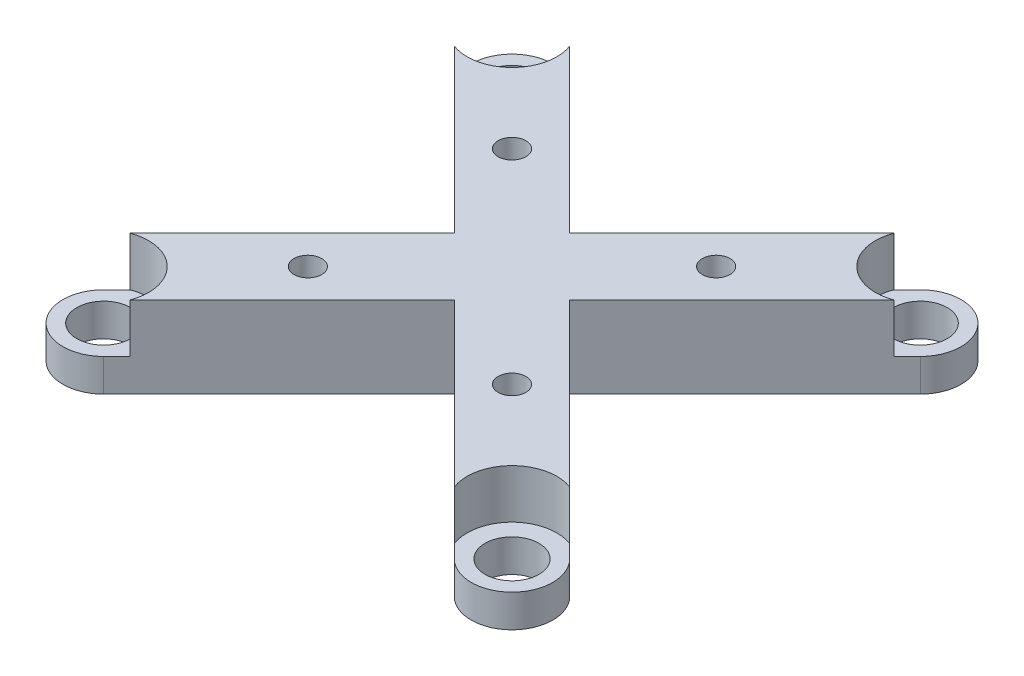
ISO-10303-21;
HEADER;
FILE_DESCRIPTION(('STEP AP214'),'2;1');
FILE_NAME('part.step','',(''),(''),'','','');
FILE_SCHEMA(('AUTOMOTIVE_DESIGN { 1 0 10303 214 1 1 1 1 }'));
ENDSEC;
DATA;
#1=APPLICATION_CONTEXT('core data for automotive mechanical design processes');
#2=APPLICATION_PROTOCOL_DEFINITION('international standard','automotive_design',2000,#1);
#3=PRODUCT_CONTEXT('',#1,'mechanical');
#4=PRODUCT('Part','Part','',(#3));
#5=PRODUCT_RELATED_PRODUCT_CATEGORY('part','',(#4));
#6=PRODUCT_DEFINITION_FORMATION('','',#4);
#7=PRODUCT_DEFINITION_CONTEXT('part definition',#1,'design');
#8=PRODUCT_DEFINITION('design','',#6,#7);
#9=PRODUCT_DEFINITION_SHAPE('','',#8);
#10=(LENGTH_UNIT() NAMED_UNIT(*) SI_UNIT(.MILLI.,.METRE.));
#11=(NAMED_UNIT(*) PLANE_ANGLE_UNIT() SI_UNIT($,.RADIAN.));
#12=(NAMED_UNIT(*) SI_UNIT($,.STERADIAN.) SOLID_ANGLE_UNIT());
#13=UNCERTAINTY_MEASURE_WITH_UNIT(LENGTH_MEASURE(1.E-05),#10,'distance_accuracy_value','');
#14=(GEOMETRIC_REPRESENTATION_CONTEXT(3) GLOBAL_UNCERTAINTY_ASSIGNED_CONTEXT((#13)) GLOBAL_UNIT_ASSIGNED_CONTEXT((#10,
#11,#12)) REPRESENTATION_CONTEXT('',''));
#15=CARTESIAN_POINT('',(0.,0.,0.));
#16=DIRECTION('',(0.,0.,1.));
#17=DIRECTION('',(1.,0.,0.));
#18=AXIS2_PLACEMENT_3D('',#15,#16,#17);
#19=CARTESIAN_POINT('',(-25.,10.,-25.));
#20=DIRECTION('',(0.,-1.,0.));
#21=DIRECTION('',(0.,0.,-1.));
#22=AXIS2_PLACEMENT_3D('',#19,#20,#21);
#23=CYLINDRICAL_SURFACE('',#22,4.99999999999999);
#24=DIRECTION('',(0.,-1.,0.));
#25=VECTOR('',#24,1.);
#26=CARTESIAN_POINT('',(-28.5355339059327,10.,-21.4644660940673));
#27=LINE('',#26,#25);
#28=CARTESIAN_POINT('',(-28.5355339059327,4.,-21.4644660940673));
#29=VERTEX_POINT('',#28);
#30=CARTESIAN_POINT('',(-28.5355339059327,0.,-21.4644660940673));
#31=VERTEX_POINT('',#30);
#32=EDGE_CURVE('E337',#29,#31,#27,.T.);
#33=ORIENTED_EDGE('',*,*,#32,.F.);
#34=CARTESIAN_POINT('',(-25.,4.,-25.));
#35=DIRECTION('',(0.,-1.,0.));
#36=DIRECTION('',(0.,0.,-1.));
#37=AXIS2_PLACEMENT_3D('',#34,#35,#36);
#38=CIRCLE('',#37,4.99999999999999);
#39=CARTESIAN_POINT('',(-21.4644660940673,4.,-28.5355339059327));
#40=VERTEX_POINT('',#39);
#41=EDGE_CURVE('E254',#29,#40,#38,.T.);
#42=ORIENTED_EDGE('',*,*,#41,.T.);
#43=DIRECTION('',(0.,-1.,0.));
#44=VECTOR('',#43,1.);
#45=CARTESIAN_POINT('',(-21.4644660940673,10.,-28.5355339059327));
#46=LINE('',#45,#44);
#47=CARTESIAN_POINT('',(-21.4644660940673,0.,-28.5355339059327));
#48=VERTEX_POINT('',#47);
#49=EDGE_CURVE('E281',#40,#48,#46,.T.);
#50=ORIENTED_EDGE('',*,*,#49,.T.);
#51=CARTESIAN_POINT('',(-25.,0.,-25.));
#52=DIRECTION('',(0.,1.,0.));
#53=DIRECTION('',(0.,0.,-1.));
#54=AXIS2_PLACEMENT_3D('',#51,#52,#53);
#55=CIRCLE('',#54,4.99999999999999);
#56=EDGE_CURVE('E260',#48,#31,#55,.T.);
#57=ORIENTED_EDGE('',*,*,#56,.T.);
#58=EDGE_LOOP('',(#33,#42,#50,#57));
#59=FACE_BOUND('',#58,.T.);
#60=ADVANCED_FACE('F33',(#59),#23,.T.);
#61=CARTESIAN_POINT('',(-7.07106781186547,10.,0.));
#62=DIRECTION('',(0.707106781186548,0.,-0.707106781186547));
#63=DIRECTION('',(-0.707106781186547,0.,-0.707106781186548));
#64=AXIS2_PLACEMENT_3D('',#61,#62,#63);
#65=PLANE('',#64);
#66=DIRECTION('',(0.,1.,0.));
#67=VECTOR('',#66,1.);
#68=CARTESIAN_POINT('',(-26.9153487313308,10.,-19.8442809194653));
#69=LINE('',#68,#67);
#70=CARTESIAN_POINT('',(-26.9153487313308,10.,-19.8442809194653));
#71=VERTEX_POINT('',#70);
#72=CARTESIAN_POINT('',(-26.9153487313308,4.,-19.8442809194653));
#73=VERTEX_POINT('',#72);
#74=EDGE_CURVE('E251',#71,#73,#69,.F.);
#75=ORIENTED_EDGE('',*,*,#74,.T.);
#76=DIRECTION('',(-0.707106781186547,0.,-0.707106781186548));
#77=VECTOR('',#76,1.);
#78=CARTESIAN_POINT('',(-7.07106781186547,4.,0.));
#79=LINE('',#78,#77);
#80=EDGE_CURVE('E257',#73,#29,#79,.T.);
#81=ORIENTED_EDGE('',*,*,#80,.T.);
#82=ORIENTED_EDGE('',*,*,#32,.T.);
#83=DIRECTION('',(0.707106781186547,0.,0.707106781186548));
#84=VECTOR('',#83,1.);
#85=CARTESIAN_POINT('',(-7.07106781186547,0.,0.));
#86=LINE('',#85,#84);
#87=CARTESIAN_POINT('',(-7.07106781186547,0.,0.));
#88=VERTEX_POINT('',#87);
#89=EDGE_CURVE('E284',#31,#88,#86,.T.);
#90=ORIENTED_EDGE('',*,*,#89,.T.);
#91=DIRECTION('',(0.,-1.,0.));
#92=VECTOR('',#91,1.);
#93=CARTESIAN_POINT('',(-7.07106781186547,10.,0.));
#94=LINE('',#93,#92);
#95=CARTESIAN_POINT('',(-7.07106781186547,10.,0.));
#96=VERTEX_POINT('',#95);
#97=EDGE_CURVE('E334',#96,#88,#94,.T.);
#98=ORIENTED_EDGE('',*,*,#97,.F.);
#99=DIRECTION('',(0.707106781186547,0.,0.707106781186548));
#100=VECTOR('',#99,1.);
#101=CARTESIAN_POINT('',(-7.07106781186547,10.,0.));
#102=LINE('',#101,#100);
#103=EDGE_CURVE('E261',#71,#96,#102,.T.);
#104=ORIENTED_EDGE('',*,*,#103,.F.);
#105=EDGE_LOOP('',(#75,#81,#82,#90,#98,#104));
#106=FACE_BOUND('',#105,.T.);
#107=ADVANCED_FACE('F394',(#106),#65,.F.);
#108=CARTESIAN_POINT('',(-7.07106781186547,10.,0.));
#109=DIRECTION('',(0.707106781186548,0.,0.707106781186547));
#110=DIRECTION('',(0.707106781186547,0.,-0.707106781186548));
#111=AXIS2_PLACEMENT_3D('',#108,#109,#110);
#112=PLANE('',#111);
#113=DIRECTION('',(0.,-1.,0.));
#114=VECTOR('',#113,1.);
#115=CARTESIAN_POINT('',(-28.5355339059327,10.,21.4644660940673));
#116=LINE('',#115,#114);
#117=CARTESIAN_POINT('',(-28.5355339059327,4.,21.4644660940673));
#118=VERTEX_POINT('',#117);
#119=CARTESIAN_POINT('',(-28.5355339059327,0.,21.4644660940673));
#120=VERTEX_POINT('',#119);
#121=EDGE_CURVE('E332',#118,#120,#116,.T.);
#122=ORIENTED_EDGE('',*,*,#121,.F.);
#123=DIRECTION('',(0.707106781186547,0.,-0.707106781186548));
#124=VECTOR('',#123,1.);
#125=CARTESIAN_POINT('',(-7.07106781186547,4.,0.));
#126=LINE('',#125,#124);
#127=CARTESIAN_POINT('',(-26.9153487313308,4.,19.8442809194653));
#128=VERTEX_POINT('',#127);
#129=EDGE_CURVE('E236',#118,#128,#126,.T.);
#130=ORIENTED_EDGE('',*,*,#129,.T.);
#131=DIRECTION('',(0.,1.,0.));
#132=VECTOR('',#131,1.);
#133=CARTESIAN_POINT('',(-26.9153487313308,10.,19.8442809194653));
#134=LINE('',#133,#132);
#135=CARTESIAN_POINT('',(-26.9153487313308,10.,19.8442809194653));
#136=VERTEX_POINT('',#135);
#137=EDGE_CURVE('E230',#128,#136,#134,.T.);
#138=ORIENTED_EDGE('',*,*,#137,.T.);
#139=DIRECTION('',(-0.707106781186547,0.,0.707106781186548));
#140=VECTOR('',#139,1.);
#141=CARTESIAN_POINT('',(-7.07106781186547,10.,0.));
#142=LINE('',#141,#140);
#143=EDGE_CURVE('E263',#96,#136,#142,.T.);
#144=ORIENTED_EDGE('',*,*,#143,.F.);
#145=ORIENTED_EDGE('',*,*,#97,.T.);
#146=DIRECTION('',(-0.707106781186547,0.,0.707106781186548));
#147=VECTOR('',#146,1.);
#148=CARTESIAN_POINT('',(-7.07106781186547,0.,0.));
#149=LINE('',#148,#147);
#150=EDGE_CURVE('E286',#88,#120,#149,.T.);
#151=ORIENTED_EDGE('',*,*,#150,.T.);
#152=EDGE_LOOP('',(#122,#130,#138,#144,#145,#151));
#153=FACE_BOUND('',#152,.T.);
#154=ADVANCED_FACE('F399',(#153),#112,.F.);
#155=CARTESIAN_POINT('',(-25.,10.,25.));
#156=DIRECTION('',(0.,-1.,0.));
#157=DIRECTION('',(0.,0.,-1.));
#158=AXIS2_PLACEMENT_3D('',#155,#156,#157);
#159=CYLINDRICAL_SURFACE('',#158,4.99999999999999);
#160=DIRECTION('',(0.,-1.,0.));
#161=VECTOR('',#160,1.);
#162=CARTESIAN_POINT('',(-21.4644660940673,10.,28.5355339059327));
#163=LINE('',#162,#161);
#164=CARTESIAN_POINT('',(-21.4644660940673,4.,28.5355339059327));
#165=VERTEX_POINT('',#164);
#166=CARTESIAN_POINT('',(-21.4644660940673,0.,28.5355339059327));
#167=VERTEX_POINT('',#166);
#168=EDGE_CURVE('E330',#165,#167,#163,.T.);
#169=ORIENTED_EDGE('',*,*,#168,.F.);
#170=CARTESIAN_POINT('',(-25.,4.,25.));
#171=DIRECTION('',(0.,-1.,0.));
#172=DIRECTION('',(0.,0.,-1.));
#173=AXIS2_PLACEMENT_3D('',#170,#171,#172);
#174=CIRCLE('',#173,4.99999999999999);
#175=EDGE_CURVE('E233',#165,#118,#174,.T.);
#176=ORIENTED_EDGE('',*,*,#175,.T.);
#177=ORIENTED_EDGE('',*,*,#121,.T.);
#178=CARTESIAN_POINT('',(-25.,0.,25.));
#179=DIRECTION('',(0.,1.,0.));
#180=DIRECTION('',(0.,0.,1.));
#181=AXIS2_PLACEMENT_3D('',#178,#179,#180);
#182=CIRCLE('',#181,4.99999999999999);
#183=EDGE_CURVE('E289',#120,#167,#182,.T.);
#184=ORIENTED_EDGE('',*,*,#183,.T.);
#185=EDGE_LOOP('',(#169,#176,#177,#184));
#186=FACE_BOUND('',#185,.T.);
#187=ADVANCED_FACE('F503',(#186),#159,.T.);
#188=CARTESIAN_POINT('',(0.,10.,7.07106781186547));
#189=DIRECTION('',(-0.707106781186548,0.,-0.707106781186548));
#190=DIRECTION('',(-0.707106781186548,0.,0.707106781186548));
#191=AXIS2_PLACEMENT_3D('',#188,#189,#190);
#192=PLANE('',#191);
#193=DIRECTION('',(0.,1.,0.));
#194=VECTOR('',#193,1.);
#195=CARTESIAN_POINT('',(-19.8442809194653,10.,26.9153487313308));
#196=LINE('',#195,#194);
#197=CARTESIAN_POINT('',(-19.8442809194653,10.,26.9153487313308));
#198=VERTEX_POINT('',#197);
#199=CARTESIAN_POINT('',(-19.8442809194653,4.,26.9153487313308));
#200=VERTEX_POINT('',#199);
#201=EDGE_CURVE('E227',#198,#200,#196,.F.);
#202=ORIENTED_EDGE('',*,*,#201,.T.);
#203=DIRECTION('',(-0.707106781186548,0.,0.707106781186548));
#204=VECTOR('',#203,1.);
#205=CARTESIAN_POINT('',(0.,4.,7.07106781186547));
#206=LINE('',#205,#204);
#207=EDGE_CURVE('E345',#200,#165,#206,.T.);
#208=ORIENTED_EDGE('',*,*,#207,.T.);
#209=ORIENTED_EDGE('',*,*,#168,.T.);
#210=DIRECTION('',(0.707106781186547,0.,-0.707106781186547));
#211=VECTOR('',#210,1.);
#212=CARTESIAN_POINT('',(0.,0.,7.07106781186547));
#213=LINE('',#212,#211);
#214=CARTESIAN_POINT('',(0.,0.,7.07106781186547));
#215=VERTEX_POINT('',#214);
#216=EDGE_CURVE('E292',#167,#215,#213,.T.);
#217=ORIENTED_EDGE('',*,*,#216,.T.);
#218=DIRECTION('',(0.,-1.,0.));
#219=VECTOR('',#218,1.);
#220=CARTESIAN_POINT('',(0.,10.,7.07106781186547));
#221=LINE('',#220,#219);
#222=CARTESIAN_POINT('',(0.,10.,7.07106781186547));
#223=VERTEX_POINT('',#222);
#224=EDGE_CURVE('E327',#223,#215,#221,.T.);
#225=ORIENTED_EDGE('',*,*,#224,.F.);
#226=DIRECTION('',(0.707106781186547,0.,-0.707106781186547));
#227=VECTOR('',#226,1.);
#228=CARTESIAN_POINT('',(0.,10.,7.07106781186547));
#229=LINE('',#228,#227);
#230=EDGE_CURVE('E267',#198,#223,#229,.T.);
#231=ORIENTED_EDGE('',*,*,#230,.F.);
#232=EDGE_LOOP('',(#202,#208,#209,#217,#225,#231));
#233=FACE_BOUND('',#232,.T.);
#234=ADVANCED_FACE('F415',(#233),#192,.F.);
#235=CARTESIAN_POINT('',(0.,10.,7.07106781186547));
#236=DIRECTION('',(0.707106781186548,0.,-0.707106781186548));
#237=DIRECTION('',(-0.707106781186548,0.,-0.707106781186548));
#238=AXIS2_PLACEMENT_3D('',#235,#236,#237);
#239=PLANE('',#238);
#240=DIRECTION('',(0.,-1.,0.));
#241=VECTOR('',#240,1.);
#242=CARTESIAN_POINT('',(21.4644660940673,10.,28.5355339059327));
#243=LINE('',#242,#241);
#244=CARTESIAN_POINT('',(21.4644660940673,4.,28.5355339059327));
#245=VERTEX_POINT('',#244);
#246=CARTESIAN_POINT('',(21.4644660940673,0.,28.5355339059327));
#247=VERTEX_POINT('',#246);
#248=EDGE_CURVE('E325',#245,#247,#243,.T.);
#249=ORIENTED_EDGE('',*,*,#248,.F.);
#250=DIRECTION('',(-0.707106781186548,0.,-0.707106781186548));
#251=VECTOR('',#250,1.);
#252=CARTESIAN_POINT('',(0.,4.,7.07106781186547));
#253=LINE('',#252,#251);
#254=CARTESIAN_POINT('',(19.8442809194653,4.,26.9153487313308));
#255=VERTEX_POINT('',#254);
#256=EDGE_CURVE('E195',#245,#255,#253,.T.);
#257=ORIENTED_EDGE('',*,*,#256,.T.);
#258=DIRECTION('',(0.,1.,0.));
#259=VECTOR('',#258,1.);
#260=CARTESIAN_POINT('',(19.8442809194653,10.,26.9153487313308));
#261=LINE('',#260,#259);
#262=CARTESIAN_POINT('',(19.8442809194653,10.,26.9153487313308));
#263=VERTEX_POINT('',#262);
#264=EDGE_CURVE('E179',#255,#263,#261,.T.);
#265=ORIENTED_EDGE('',*,*,#264,.T.);
#266=DIRECTION('',(0.707106781186547,0.,0.707106781186547));
#267=VECTOR('',#266,1.);
#268=CARTESIAN_POINT('',(0.,10.,7.07106781186547));
#269=LINE('',#268,#267);
#270=EDGE_CURVE('E269',#223,#263,#269,.T.);
#271=ORIENTED_EDGE('',*,*,#270,.F.);
#272=ORIENTED_EDGE('',*,*,#224,.T.);
#273=DIRECTION('',(0.707106781186547,0.,0.707106781186547));
#274=VECTOR('',#273,1.);
#275=CARTESIAN_POINT('',(0.,0.,7.07106781186547));
#276=LINE('',#275,#274);
#277=EDGE_CURVE('E294',#215,#247,#276,.T.);
#278=ORIENTED_EDGE('',*,*,#277,.T.);
#279=EDGE_LOOP('',(#249,#257,#265,#271,#272,#278));
#280=FACE_BOUND('',#279,.T.);
#281=ADVANCED_FACE('F420',(#280),#239,.F.);
#282=CARTESIAN_POINT('',(25.,10.,25.));
#283=DIRECTION('',(0.,-1.,0.));
#284=DIRECTION('',(0.,0.,-1.));
#285=AXIS2_PLACEMENT_3D('',#282,#283,#284);
#286=CYLINDRICAL_SURFACE('',#285,4.99999999999999);
#287=DIRECTION('',(0.,-1.,0.));
#288=VECTOR('',#287,1.);
#289=CARTESIAN_POINT('',(28.5355339059327,10.,21.4644660940673));
#290=LINE('',#289,#288);
#291=CARTESIAN_POINT('',(28.5355339059327,4.,21.4644660940673));
#292=VERTEX_POINT('',#291);
#293=CARTESIAN_POINT('',(28.5355339059327,0.,21.4644660940673));
#294=VERTEX_POINT('',#293);
#295=EDGE_CURVE('E323',#292,#294,#290,.T.);
#296=ORIENTED_EDGE('',*,*,#295,.F.);
#297=CARTESIAN_POINT('',(25.,4.,25.));
#298=DIRECTION('',(0.,-1.,0.));
#299=DIRECTION('',(0.,0.,-1.));
#300=AXIS2_PLACEMENT_3D('',#297,#298,#299);
#301=CIRCLE('',#300,4.99999999999999);
#302=EDGE_CURVE('E174',#292,#245,#301,.T.);
#303=ORIENTED_EDGE('',*,*,#302,.T.);
#304=ORIENTED_EDGE('',*,*,#248,.T.);
#305=CARTESIAN_POINT('',(25.,0.,25.));
#306=DIRECTION('',(0.,1.,0.));
#307=DIRECTION('',(0.,0.,-1.));
#308=AXIS2_PLACEMENT_3D('',#305,#306,#307);
#309=CIRCLE('',#308,4.99999999999999);
#310=EDGE_CURVE('E297',#247,#294,#309,.T.);
#311=ORIENTED_EDGE('',*,*,#310,.T.);
#312=EDGE_LOOP('',(#296,#303,#304,#311));
#313=FACE_BOUND('',#312,.T.);
#314=ADVANCED_FACE('F495',(#313),#286,.T.);
#315=CARTESIAN_POINT('',(7.07106781186547,10.,0.));
#316=DIRECTION('',(-0.707106781186548,0.,0.707106781186547));
#317=DIRECTION('',(0.707106781186547,0.,0.707106781186548));
#318=AXIS2_PLACEMENT_3D('',#315,#316,#317);
#319=PLANE('',#318);
#320=DIRECTION('',(0.,1.,0.));
#321=VECTOR('',#320,1.);
#322=CARTESIAN_POINT('',(26.9153487313308,10.,19.8442809194653));
#323=LINE('',#322,#321);
#324=CARTESIAN_POINT('',(26.9153487313308,10.,19.8442809194653));
#325=VERTEX_POINT('',#324);
#326=CARTESIAN_POINT('',(26.9153487313308,4.,19.8442809194653));
#327=VERTEX_POINT('',#326);
#328=EDGE_CURVE('E47',#325,#327,#323,.F.);
#329=ORIENTED_EDGE('',*,*,#328,.T.);
#330=DIRECTION('',(0.707106781186547,0.,0.707106781186548));
#331=VECTOR('',#330,1.);
#332=CARTESIAN_POINT('',(7.07106781186547,4.,0.));
#333=LINE('',#332,#331);
#334=EDGE_CURVE('E11',#327,#292,#333,.T.);
#335=ORIENTED_EDGE('',*,*,#334,.T.);
#336=ORIENTED_EDGE('',*,*,#295,.T.);
#337=DIRECTION('',(-0.707106781186547,0.,-0.707106781186548));
#338=VECTOR('',#337,1.);
#339=CARTESIAN_POINT('',(7.07106781186547,0.,0.));
#340=LINE('',#339,#338);
#341=CARTESIAN_POINT('',(7.07106781186547,0.,0.));
#342=VERTEX_POINT('',#341);
#343=EDGE_CURVE('E300',#294,#342,#340,.T.);
#344=ORIENTED_EDGE('',*,*,#343,.T.);
#345=DIRECTION('',(0.,-1.,0.));
#346=VECTOR('',#345,1.);
#347=CARTESIAN_POINT('',(7.07106781186547,10.,0.));
#348=LINE('',#347,#346);
#349=CARTESIAN_POINT('',(7.07106781186547,10.,0.));
#350=VERTEX_POINT('',#349);
#351=EDGE_CURVE('E320',#350,#342,#348,.T.);
#352=ORIENTED_EDGE('',*,*,#351,.F.);
#353=DIRECTION('',(-0.707106781186547,0.,-0.707106781186548));
#354=VECTOR('',#353,1.);
#355=CARTESIAN_POINT('',(7.07106781186547,10.,0.));
#356=LINE('',#355,#354);
#357=EDGE_CURVE('E186',#325,#350,#356,.T.);
#358=ORIENTED_EDGE('',*,*,#357,.F.);
#359=EDGE_LOOP('',(#329,#335,#336,#344,#352,#358));
#360=FACE_BOUND('',#359,.T.);
#361=ADVANCED_FACE('F184',(#360),#319,.F.);
#362=CARTESIAN_POINT('',(7.07106781186547,10.,0.));
#363=DIRECTION('',(-0.707106781186548,0.,-0.707106781186547));
#364=DIRECTION('',(-0.707106781186547,0.,0.707106781186548));
#365=AXIS2_PLACEMENT_3D('',#362,#363,#364);
#366=PLANE('',#365);
#367=DIRECTION('',(0.,-1.,0.));
#368=VECTOR('',#367,1.);
#369=CARTESIAN_POINT('',(28.5355339059327,10.,-21.4644660940673));
#370=LINE('',#369,#368);
#371=CARTESIAN_POINT('',(28.5355339059327,4.,-21.4644660940673));
#372=VERTEX_POINT('',#371);
#373=CARTESIAN_POINT('',(28.5355339059327,0.,-21.4644660940673));
#374=VERTEX_POINT('',#373);
#375=EDGE_CURVE('E318',#372,#374,#370,.T.);
#376=ORIENTED_EDGE('',*,*,#375,.F.);
#377=DIRECTION('',(-0.707106781186547,0.,0.707106781186548));
#378=VECTOR('',#377,1.);
#379=CARTESIAN_POINT('',(7.07106781186547,4.,0.));
#380=LINE('',#379,#378);
#381=CARTESIAN_POINT('',(26.9153487313308,4.,-19.8442809194653));
#382=VERTEX_POINT('',#381);
#383=EDGE_CURVE('E213',#372,#382,#380,.T.);
#384=ORIENTED_EDGE('',*,*,#383,.T.);
#385=DIRECTION('',(0.,1.,0.));
#386=VECTOR('',#385,1.);
#387=CARTESIAN_POINT('',(26.9153487313308,10.,-19.8442809194653));
#388=LINE('',#387,#386);
#389=CARTESIAN_POINT('',(26.9153487313308,10.,-19.8442809194653));
#390=VERTEX_POINT('',#389);
#391=EDGE_CURVE('E207',#382,#390,#388,.T.);
#392=ORIENTED_EDGE('',*,*,#391,.T.);
#393=DIRECTION('',(0.707106781186547,0.,-0.707106781186548));
#394=VECTOR('',#393,1.);
#395=CARTESIAN_POINT('',(7.07106781186547,10.,0.));
#396=LINE('',#395,#394);
#397=EDGE_CURVE('E273',#350,#390,#396,.T.);
#398=ORIENTED_EDGE('',*,*,#397,.F.);
#399=ORIENTED_EDGE('',*,*,#351,.T.);
#400=DIRECTION('',(0.707106781186547,0.,-0.707106781186548));
#401=VECTOR('',#400,1.);
#402=CARTESIAN_POINT('',(7.07106781186547,0.,0.));
#403=LINE('',#402,#401);
#404=EDGE_CURVE('E302',#342,#374,#403,.T.);
#405=ORIENTED_EDGE('',*,*,#404,.T.);
#406=EDGE_LOOP('',(#376,#384,#392,#398,#399,#405));
#407=FACE_BOUND('',#406,.T.);
#408=ADVANCED_FACE('F376',(#407),#366,.F.);
#409=CARTESIAN_POINT('',(25.,10.,-25.));
#410=DIRECTION('',(0.,-1.,0.));
#411=DIRECTION('',(0.,0.,-1.));
#412=AXIS2_PLACEMENT_3D('',#409,#410,#411);
#413=CYLINDRICAL_SURFACE('',#412,4.99999999999999);
#414=DIRECTION('',(0.,-1.,0.));
#415=VECTOR('',#414,1.);
#416=CARTESIAN_POINT('',(21.4644660940673,10.,-28.5355339059327));
#417=LINE('',#416,#415);
#418=CARTESIAN_POINT('',(21.4644660940673,4.,-28.5355339059327));
#419=VERTEX_POINT('',#418);
#420=CARTESIAN_POINT('',(21.4644660940673,0.,-28.5355339059327));
#421=VERTEX_POINT('',#420);
#422=EDGE_CURVE('E316',#419,#421,#417,.T.);
#423=ORIENTED_EDGE('',*,*,#422,.F.);
#424=CARTESIAN_POINT('',(25.,4.,-25.));
#425=DIRECTION('',(0.,-1.,0.));
#426=DIRECTION('',(0.,0.,-1.));
#427=AXIS2_PLACEMENT_3D('',#424,#425,#426);
#428=CIRCLE('',#427,4.99999999999999);
#429=EDGE_CURVE('E210',#419,#372,#428,.T.);
#430=ORIENTED_EDGE('',*,*,#429,.T.);
#431=ORIENTED_EDGE('',*,*,#375,.T.);
#432=CARTESIAN_POINT('',(25.,0.,-25.));
#433=DIRECTION('',(0.,1.,0.));
#434=DIRECTION('',(0.,0.,1.));
#435=AXIS2_PLACEMENT_3D('',#432,#433,#434);
#436=CIRCLE('',#435,4.99999999999999);
#437=EDGE_CURVE('E305',#374,#421,#436,.T.);
#438=ORIENTED_EDGE('',*,*,#437,.T.);
#439=EDGE_LOOP('',(#423,#430,#431,#438));
#440=FACE_BOUND('',#439,.T.);
#441=ADVANCED_FACE('F356',(#440),#413,.T.);
#442=CARTESIAN_POINT('',(0.,10.,-7.07106781186547));
#443=DIRECTION('',(0.707106781186548,0.,0.707106781186548));
#444=DIRECTION('',(0.707106781186548,0.,-0.707106781186548));
#445=AXIS2_PLACEMENT_3D('',#442,#443,#444);
#446=PLANE('',#445);
#447=DIRECTION('',(0.,1.,0.));
#448=VECTOR('',#447,1.);
#449=CARTESIAN_POINT('',(19.8442809194653,10.,-26.9153487313308));
#450=LINE('',#449,#448);
#451=CARTESIAN_POINT('',(19.8442809194653,10.,-26.9153487313308));
#452=VERTEX_POINT('',#451);
#453=CARTESIAN_POINT('',(19.8442809194653,4.,-26.9153487313308));
#454=VERTEX_POINT('',#453);
#455=EDGE_CURVE('E55',#452,#454,#450,.F.);
#456=ORIENTED_EDGE('',*,*,#455,.T.);
#457=DIRECTION('',(0.707106781186548,0.,-0.707106781186548));
#458=VECTOR('',#457,1.);
#459=CARTESIAN_POINT('',(0.,4.,-7.07106781186547));
#460=LINE('',#459,#458);
#461=EDGE_CURVE('E40',#454,#419,#460,.T.);
#462=ORIENTED_EDGE('',*,*,#461,.T.);
#463=ORIENTED_EDGE('',*,*,#422,.T.);
#464=DIRECTION('',(-0.707106781186547,0.,0.707106781186547));
#465=VECTOR('',#464,1.);
#466=CARTESIAN_POINT('',(0.,0.,-7.07106781186547));
#467=LINE('',#466,#465);
#468=CARTESIAN_POINT('',(0.,0.,-7.07106781186547));
#469=VERTEX_POINT('',#468);
#470=EDGE_CURVE('E308',#421,#469,#467,.T.);
#471=ORIENTED_EDGE('',*,*,#470,.T.);
#472=DIRECTION('',(0.,-1.,0.));
#473=VECTOR('',#472,1.);
#474=CARTESIAN_POINT('',(0.,10.,-7.07106781186547));
#475=LINE('',#474,#473);
#476=CARTESIAN_POINT('',(0.,10.,-7.07106781186547));
#477=VERTEX_POINT('',#476);
#478=EDGE_CURVE('E313',#477,#469,#475,.T.);
#479=ORIENTED_EDGE('',*,*,#478,.F.);
#480=DIRECTION('',(-0.707106781186547,0.,0.707106781186547));
#481=VECTOR('',#480,1.);
#482=CARTESIAN_POINT('',(0.,10.,-7.07106781186547));
#483=LINE('',#482,#481);
#484=EDGE_CURVE('E276',#452,#477,#483,.T.);
#485=ORIENTED_EDGE('',*,*,#484,.F.);
#486=EDGE_LOOP('',(#456,#462,#463,#471,#479,#485));
#487=FACE_BOUND('',#486,.T.);
#488=ADVANCED_FACE('F352',(#487),#446,.F.);
#489=CARTESIAN_POINT('',(0.,10.,-7.07106781186547));
#490=DIRECTION('',(-0.707106781186548,0.,0.707106781186548));
#491=DIRECTION('',(0.707106781186548,0.,0.707106781186548));
#492=AXIS2_PLACEMENT_3D('',#489,#490,#491);
#493=PLANE('',#492);
#494=ORIENTED_EDGE('',*,*,#49,.F.);
#495=DIRECTION('',(0.707106781186548,0.,0.707106781186548));
#496=VECTOR('',#495,1.);
#497=CARTESIAN_POINT('',(0.,4.,-7.07106781186547));
#498=LINE('',#497,#496);
#499=CARTESIAN_POINT('',(-19.8442809194653,4.,-26.9153487313308));
#500=VERTEX_POINT('',#499);
#501=EDGE_CURVE('E342',#40,#500,#498,.T.);
#502=ORIENTED_EDGE('',*,*,#501,.T.);
#503=DIRECTION('',(0.,1.,0.));
#504=VECTOR('',#503,1.);
#505=CARTESIAN_POINT('',(-19.8442809194653,10.,-26.9153487313308));
#506=LINE('',#505,#504);
#507=CARTESIAN_POINT('',(-19.8442809194653,10.,-26.9153487313308));
#508=VERTEX_POINT('',#507);
#509=EDGE_CURVE('E248',#500,#508,#506,.T.);
#510=ORIENTED_EDGE('',*,*,#509,.T.);
#511=DIRECTION('',(-0.707106781186547,0.,-0.707106781186547));
#512=VECTOR('',#511,1.);
#513=CARTESIAN_POINT('',(0.,10.,-7.07106781186547));
#514=LINE('',#513,#512);
#515=EDGE_CURVE('E278',#477,#508,#514,.T.);
#516=ORIENTED_EDGE('',*,*,#515,.F.);
#517=ORIENTED_EDGE('',*,*,#478,.T.);
#518=DIRECTION('',(-0.707106781186547,0.,-0.707106781186547));
#519=VECTOR('',#518,1.);
#520=CARTESIAN_POINT('',(0.,0.,-7.07106781186547));
#521=LINE('',#520,#519);
#522=EDGE_CURVE('E264',#469,#48,#521,.T.);
#523=ORIENTED_EDGE('',*,*,#522,.T.);
#524=EDGE_LOOP('',(#494,#502,#510,#516,#517,#523));
#525=FACE_BOUND('',#524,.T.);
#526=ADVANCED_FACE('F369',(#525),#493,.F.);
#527=CARTESIAN_POINT('',(-25.,10.,-25.));
#528=DIRECTION('',(0.,-1.,0.));
#529=DIRECTION('',(0.,0.,-1.));
#530=AXIS2_PLACEMENT_3D('',#527,#528,#529);
#531=PLANE('',#530);
#532=CARTESIAN_POINT('',(12.5,10.,-12.5));
#533=DIRECTION('',(0.,-1.,0.));
#534=DIRECTION('',(0.,0.,-1.));
#535=AXIS2_PLACEMENT_3D('',#532,#533,#534);
#536=CIRCLE('',#535,1.7);
#537=CARTESIAN_POINT('',(12.5,10.,-14.2));
#538=VERTEX_POINT('',#537);
#539=EDGE_CURVE('E750',#538,#538,#536,.T.);
#540=ORIENTED_EDGE('',*,*,#539,.T.);
#541=EDGE_LOOP('',(#540));
#542=FACE_BOUND('',#541,.T.);
#543=CARTESIAN_POINT('',(12.5,10.,12.5));
#544=DIRECTION('',(0.,-1.,0.));
#545=DIRECTION('',(0.,0.,-1.));
#546=AXIS2_PLACEMENT_3D('',#543,#544,#545);
#547=CIRCLE('',#546,1.7);
#548=CARTESIAN_POINT('',(12.5,10.,10.8));
#549=VERTEX_POINT('',#548);
#550=EDGE_CURVE('E762',#549,#549,#547,.T.);
#551=ORIENTED_EDGE('',*,*,#550,.T.);
#552=EDGE_LOOP('',(#551));
#553=FACE_BOUND('',#552,.T.);
#554=CARTESIAN_POINT('',(-12.5,10.,-12.5));
#555=DIRECTION('',(0.,-1.,0.));
#556=DIRECTION('',(0.,0.,-1.));
#557=AXIS2_PLACEMENT_3D('',#554,#555,#556);
#558=CIRCLE('',#557,1.7);
#559=CARTESIAN_POINT('',(-12.5,10.,-14.2));
#560=VERTEX_POINT('',#559);
#561=EDGE_CURVE('E774',#560,#560,#558,.T.);
#562=ORIENTED_EDGE('',*,*,#561,.T.);
#563=EDGE_LOOP('',(#562));
#564=FACE_BOUND('',#563,.T.);
#565=CARTESIAN_POINT('',(-12.5,10.,12.5));
#566=DIRECTION('',(0.,-1.,0.));
#567=DIRECTION('',(0.,0.,-1.));
#568=AXIS2_PLACEMENT_3D('',#565,#566,#567);
#569=CIRCLE('',#568,1.7);
#570=CARTESIAN_POINT('',(-12.5,10.,10.8));
#571=VERTEX_POINT('',#570);
#572=EDGE_CURVE('E421',#571,#571,#569,.T.);
#573=ORIENTED_EDGE('',*,*,#572,.T.);
#574=EDGE_LOOP('',(#573));
#575=FACE_BOUND('',#574,.T.);
#576=ORIENTED_EDGE('',*,*,#270,.T.);
#577=CARTESIAN_POINT('',(25.,10.,25.));
#578=DIRECTION('',(0.,1.,0.));
#579=DIRECTION('',(0.,0.,1.));
#580=AXIS2_PLACEMENT_3D('',#577,#578,#579);
#581=CIRCLE('',#580,5.49999999999999);
#582=EDGE_CURVE('E181',#325,#263,#581,.T.);
#583=ORIENTED_EDGE('',*,*,#582,.F.);
#584=ORIENTED_EDGE('',*,*,#357,.T.);
#585=ORIENTED_EDGE('',*,*,#397,.T.);
#586=CARTESIAN_POINT('',(25.,10.,-25.));
#587=DIRECTION('',(0.,-1.,0.));
#588=DIRECTION('',(0.,0.,-1.));
#589=AXIS2_PLACEMENT_3D('',#586,#587,#588);
#590=CIRCLE('',#589,5.49999999999999);
#591=EDGE_CURVE('E348',#390,#452,#590,.T.);
#592=ORIENTED_EDGE('',*,*,#591,.T.);
#593=ORIENTED_EDGE('',*,*,#484,.T.);
#594=ORIENTED_EDGE('',*,*,#515,.T.);
#595=CARTESIAN_POINT('',(-25.,10.,-25.));
#596=DIRECTION('',(0.,-1.,0.));
#597=DIRECTION('',(0.,0.,-1.));
#598=AXIS2_PLACEMENT_3D('',#595,#596,#597);
#599=CIRCLE('',#598,5.49999999999999);
#600=EDGE_CURVE('E339',#508,#71,#599,.T.);
#601=ORIENTED_EDGE('',*,*,#600,.T.);
#602=ORIENTED_EDGE('',*,*,#103,.T.);
#603=ORIENTED_EDGE('',*,*,#143,.T.);
#604=CARTESIAN_POINT('',(-25.,10.,25.));
#605=DIRECTION('',(0.,1.,0.));
#606=DIRECTION('',(0.,0.,1.));
#607=AXIS2_PLACEMENT_3D('',#604,#605,#606);
#608=CIRCLE('',#607,5.49999999999999);
#609=EDGE_CURVE('E216',#198,#136,#608,.T.);
#610=ORIENTED_EDGE('',*,*,#609,.F.);
#611=ORIENTED_EDGE('',*,*,#230,.T.);
#612=EDGE_LOOP('',(#576,#583,#584,#585,#592,#593,#594,#601,#602,#603,#610,#611));
#613=FACE_BOUND('',#612,.T.);
#614=ADVANCED_FACE('F371',(#542,#553,#564,#575,#613),#531,.F.);
#615=CARTESIAN_POINT('',(-25.,0.,-25.));
#616=DIRECTION('',(0.,-1.,0.));
#617=DIRECTION('',(0.,0.,-1.));
#618=AXIS2_PLACEMENT_3D('',#615,#616,#617);
#619=PLANE('',#618);
#620=CARTESIAN_POINT('',(12.5,0.,-12.5));
#621=DIRECTION('',(0.,-1.,0.));
#622=DIRECTION('',(0.,0.,-1.));
#623=AXIS2_PLACEMENT_3D('',#620,#621,#622);
#624=CIRCLE('',#623,3.25);
#625=CARTESIAN_POINT('',(12.5,0.,-15.75));
#626=VERTEX_POINT('',#625);
#627=EDGE_CURVE('E743',#626,#626,#624,.T.);
#628=ORIENTED_EDGE('',*,*,#627,.F.);
#629=EDGE_LOOP('',(#628));
#630=FACE_BOUND('',#629,.T.);
#631=CARTESIAN_POINT('',(12.5,0.,12.5));
#632=DIRECTION('',(0.,-1.,0.));
#633=DIRECTION('',(0.,0.,-1.));
#634=AXIS2_PLACEMENT_3D('',#631,#632,#633);
#635=CIRCLE('',#634,3.25);
#636=CARTESIAN_POINT('',(12.5,0.,9.25));
#637=VERTEX_POINT('',#636);
#638=EDGE_CURVE('E753',#637,#637,#635,.T.);
#639=ORIENTED_EDGE('',*,*,#638,.F.);
#640=EDGE_LOOP('',(#639));
#641=FACE_BOUND('',#640,.T.);
#642=CARTESIAN_POINT('',(-12.5,0.,-12.5));
#643=DIRECTION('',(0.,-1.,0.));
#644=DIRECTION('',(0.,0.,-1.));
#645=AXIS2_PLACEMENT_3D('',#642,#643,#644);
#646=CIRCLE('',#645,3.25);
#647=CARTESIAN_POINT('',(-12.5,0.,-15.75));
#648=VERTEX_POINT('',#647);
#649=EDGE_CURVE('E765',#648,#648,#646,.T.);
#650=ORIENTED_EDGE('',*,*,#649,.F.);
#651=EDGE_LOOP('',(#650));
#652=FACE_BOUND('',#651,.T.);
#653=CARTESIAN_POINT('',(-12.5,0.,12.5));
#654=DIRECTION('',(0.,-1.,0.));
#655=DIRECTION('',(0.,0.,-1.));
#656=AXIS2_PLACEMENT_3D('',#653,#654,#655);
#657=CIRCLE('',#656,3.25);
#658=CARTESIAN_POINT('',(-12.5,0.,9.25));
#659=VERTEX_POINT('',#658);
#660=EDGE_CURVE('E777',#659,#659,#657,.T.);
#661=ORIENTED_EDGE('',*,*,#660,.F.);
#662=EDGE_LOOP('',(#661));
#663=FACE_BOUND('',#662,.T.);
#664=CARTESIAN_POINT('',(25.,0.,25.));
#665=DIRECTION('',(0.,1.,0.));
#666=DIRECTION('',(0.,0.,1.));
#667=AXIS2_PLACEMENT_3D('',#664,#665,#666);
#668=CIRCLE('',#667,3.30000000000001);
#669=CARTESIAN_POINT('',(25.,0.,28.3));
#670=VERTEX_POINT('',#669);
#671=EDGE_CURVE('E187',#670,#670,#668,.T.);
#672=ORIENTED_EDGE('',*,*,#671,.T.);
#673=EDGE_LOOP('',(#672));
#674=FACE_BOUND('',#673,.T.);
#675=CARTESIAN_POINT('',(25.,0.,-25.));
#676=DIRECTION('',(0.,1.,0.));
#677=DIRECTION('',(0.,0.,1.));
#678=AXIS2_PLACEMENT_3D('',#675,#676,#677);
#679=CIRCLE('',#678,3.30000000000001);
#680=CARTESIAN_POINT('',(25.,0.,-21.7));
#681=VERTEX_POINT('',#680);
#682=EDGE_CURVE('E203',#681,#681,#679,.T.);
#683=ORIENTED_EDGE('',*,*,#682,.T.);
#684=EDGE_LOOP('',(#683));
#685=FACE_BOUND('',#684,.T.);
#686=CARTESIAN_POINT('',(-25.,0.,25.));
#687=DIRECTION('',(0.,1.,0.));
#688=DIRECTION('',(0.,0.,1.));
#689=AXIS2_PLACEMENT_3D('',#686,#687,#688);
#690=CIRCLE('',#689,3.30000000000001);
#691=CARTESIAN_POINT('',(-25.,0.,28.3));
#692=VERTEX_POINT('',#691);
#693=EDGE_CURVE('E224',#692,#692,#690,.T.);
#694=ORIENTED_EDGE('',*,*,#693,.T.);
#695=EDGE_LOOP('',(#694));
#696=FACE_BOUND('',#695,.T.);
#697=CARTESIAN_POINT('',(-25.,0.,-25.));
#698=DIRECTION('',(0.,1.,0.));
#699=DIRECTION('',(0.,0.,1.));
#700=AXIS2_PLACEMENT_3D('',#697,#698,#699);
#701=CIRCLE('',#700,3.30000000000001);
#702=CARTESIAN_POINT('',(-25.,0.,-21.7));
#703=VERTEX_POINT('',#702);
#704=EDGE_CURVE('E245',#703,#703,#701,.T.);
#705=ORIENTED_EDGE('',*,*,#704,.T.);
#706=EDGE_LOOP('',(#705));
#707=FACE_BOUND('',#706,.T.);
#708=ORIENTED_EDGE('',*,*,#56,.F.);
#709=ORIENTED_EDGE('',*,*,#522,.F.);
#710=ORIENTED_EDGE('',*,*,#470,.F.);
#711=ORIENTED_EDGE('',*,*,#437,.F.);
#712=ORIENTED_EDGE('',*,*,#404,.F.);
#713=ORIENTED_EDGE('',*,*,#343,.F.);
#714=ORIENTED_EDGE('',*,*,#310,.F.);
#715=ORIENTED_EDGE('',*,*,#277,.F.);
#716=ORIENTED_EDGE('',*,*,#216,.F.);
#717=ORIENTED_EDGE('',*,*,#183,.F.);
#718=ORIENTED_EDGE('',*,*,#150,.F.);
#719=ORIENTED_EDGE('',*,*,#89,.F.);
#720=EDGE_LOOP('',(#708,#709,#710,#711,#712,#713,#714,#715,#716,#717,#718,#719));
#721=FACE_BOUND('',#720,.T.);
#722=ADVANCED_FACE('F364',(#630,#641,#652,#663,#674,#685,#696,#707,#721),#619,.T.);
#723=CARTESIAN_POINT('',(-21.7,4.,-25.));
#724=DIRECTION('',(0.,-1.,0.));
#725=DIRECTION('',(0.,0.,-1.));
#726=AXIS2_PLACEMENT_3D('',#723,#724,#725);
#727=PLANE('',#726);
#728=CARTESIAN_POINT('',(-25.,4.,-25.));
#729=DIRECTION('',(0.,1.,0.));
#730=DIRECTION('',(0.,0.,1.));
#731=AXIS2_PLACEMENT_3D('',#728,#729,#730);
#732=CIRCLE('',#731,3.30000000000001);
#733=CARTESIAN_POINT('',(-25.,4.,-21.7));
#734=VERTEX_POINT('',#733);
#735=EDGE_CURVE('E242',#734,#734,#732,.T.);
#736=ORIENTED_EDGE('',*,*,#735,.F.);
#737=EDGE_LOOP('',(#736));
#738=FACE_BOUND('',#737,.T.);
#739=CARTESIAN_POINT('',(-25.,4.,-25.));
#740=DIRECTION('',(0.,1.,0.));
#741=DIRECTION('',(0.,0.,1.));
#742=AXIS2_PLACEMENT_3D('',#739,#740,#741);
#743=CIRCLE('',#742,5.49999999999999);
#744=EDGE_CURVE('E239',#73,#500,#743,.T.);
#745=ORIENTED_EDGE('',*,*,#744,.T.);
#746=ORIENTED_EDGE('',*,*,#501,.F.);
#747=ORIENTED_EDGE('',*,*,#41,.F.);
#748=ORIENTED_EDGE('',*,*,#80,.F.);
#749=EDGE_LOOP('',(#745,#746,#747,#748));
#750=FACE_BOUND('',#749,.T.);
#751=ADVANCED_FACE('F454',(#738,#750),#727,.F.);
#752=CARTESIAN_POINT('',(-25.,10.,-25.));
#753=DIRECTION('',(0.,1.,0.));
#754=DIRECTION('',(0.,0.,1.));
#755=AXIS2_PLACEMENT_3D('',#752,#753,#754);
#756=CYLINDRICAL_SURFACE('',#755,5.49999999999999);
#757=ORIENTED_EDGE('',*,*,#600,.F.);
#758=ORIENTED_EDGE('',*,*,#509,.F.);
#759=ORIENTED_EDGE('',*,*,#744,.F.);
#760=ORIENTED_EDGE('',*,*,#74,.F.);
#761=EDGE_LOOP('',(#757,#758,#759,#760));
#762=FACE_BOUND('',#761,.T.);
#763=ADVANCED_FACE('F467',(#762),#756,.F.);
#764=CARTESIAN_POINT('',(-25.,10.,-25.));
#765=DIRECTION('',(0.,1.,0.));
#766=DIRECTION('',(0.,0.,1.));
#767=AXIS2_PLACEMENT_3D('',#764,#765,#766);
#768=CYLINDRICAL_SURFACE('',#767,3.30000000000001);
#769=ORIENTED_EDGE('',*,*,#704,.F.);
#770=EDGE_LOOP('',(#769));
#771=FACE_BOUND('',#770,.T.);
#772=ORIENTED_EDGE('',*,*,#735,.T.);
#773=EDGE_LOOP('',(#772));
#774=FACE_BOUND('',#773,.T.);
#775=ADVANCED_FACE('F463',(#771,#774),#768,.F.);
#776=CARTESIAN_POINT('',(-21.7,4.,25.));
#777=DIRECTION('',(0.,-1.,0.));
#778=DIRECTION('',(0.,0.,-1.));
#779=AXIS2_PLACEMENT_3D('',#776,#777,#778);
#780=PLANE('',#779);
#781=CARTESIAN_POINT('',(-25.,4.,25.));
#782=DIRECTION('',(0.,1.,0.));
#783=DIRECTION('',(0.,0.,1.));
#784=AXIS2_PLACEMENT_3D('',#781,#782,#783);
#785=CIRCLE('',#784,3.30000000000001);
#786=CARTESIAN_POINT('',(-25.,4.,28.3));
#787=VERTEX_POINT('',#786);
#788=EDGE_CURVE('E221',#787,#787,#785,.T.);
#789=ORIENTED_EDGE('',*,*,#788,.F.);
#790=EDGE_LOOP('',(#789));
#791=FACE_BOUND('',#790,.T.);
#792=ORIENTED_EDGE('',*,*,#175,.F.);
#793=ORIENTED_EDGE('',*,*,#207,.F.);
#794=CARTESIAN_POINT('',(-25.,4.,25.));
#795=DIRECTION('',(0.,1.,0.));
#796=DIRECTION('',(0.,0.,1.));
#797=AXIS2_PLACEMENT_3D('',#794,#795,#796);
#798=CIRCLE('',#797,5.49999999999999);
#799=EDGE_CURVE('E218',#200,#128,#798,.T.);
#800=ORIENTED_EDGE('',*,*,#799,.T.);
#801=ORIENTED_EDGE('',*,*,#129,.F.);
#802=EDGE_LOOP('',(#792,#793,#800,#801));
#803=FACE_BOUND('',#802,.T.);
#804=ADVANCED_FACE('F466',(#791,#803),#780,.F.);
#805=CARTESIAN_POINT('',(-25.,10.,25.));
#806=DIRECTION('',(0.,1.,0.));
#807=DIRECTION('',(0.,0.,1.));
#808=AXIS2_PLACEMENT_3D('',#805,#806,#807);
#809=CYLINDRICAL_SURFACE('',#808,5.49999999999999);
#810=ORIENTED_EDGE('',*,*,#799,.F.);
#811=ORIENTED_EDGE('',*,*,#201,.F.);
#812=ORIENTED_EDGE('',*,*,#609,.T.);
#813=ORIENTED_EDGE('',*,*,#137,.F.);
#814=EDGE_LOOP('',(#810,#811,#812,#813));
#815=FACE_BOUND('',#814,.T.);
#816=ADVANCED_FACE('F388',(#815),#809,.F.);
#817=CARTESIAN_POINT('',(-25.,10.,25.));
#818=DIRECTION('',(0.,1.,0.));
#819=DIRECTION('',(0.,0.,1.));
#820=AXIS2_PLACEMENT_3D('',#817,#818,#819);
#821=CYLINDRICAL_SURFACE('',#820,3.30000000000001);
#822=ORIENTED_EDGE('',*,*,#693,.F.);
#823=EDGE_LOOP('',(#822));
#824=FACE_BOUND('',#823,.T.);
#825=ORIENTED_EDGE('',*,*,#788,.T.);
#826=EDGE_LOOP('',(#825));
#827=FACE_BOUND('',#826,.T.);
#828=ADVANCED_FACE('F379',(#824,#827),#821,.F.);
#829=CARTESIAN_POINT('',(28.3,4.,-25.));
#830=DIRECTION('',(0.,-1.,0.));
#831=DIRECTION('',(0.,0.,-1.));
#832=AXIS2_PLACEMENT_3D('',#829,#830,#831);
#833=PLANE('',#832);
#834=CARTESIAN_POINT('',(25.,4.,-25.));
#835=DIRECTION('',(0.,1.,0.));
#836=DIRECTION('',(0.,0.,1.));
#837=AXIS2_PLACEMENT_3D('',#834,#835,#836);
#838=CIRCLE('',#837,3.30000000000001);
#839=CARTESIAN_POINT('',(25.,4.,-21.7));
#840=VERTEX_POINT('',#839);
#841=EDGE_CURVE('E200',#840,#840,#838,.T.);
#842=ORIENTED_EDGE('',*,*,#841,.F.);
#843=EDGE_LOOP('',(#842));
#844=FACE_BOUND('',#843,.T.);
#845=ORIENTED_EDGE('',*,*,#429,.F.);
#846=ORIENTED_EDGE('',*,*,#461,.F.);
#847=CARTESIAN_POINT('',(25.,4.,-25.));
#848=DIRECTION('',(0.,1.,0.));
#849=DIRECTION('',(0.,0.,1.));
#850=AXIS2_PLACEMENT_3D('',#847,#848,#849);
#851=CIRCLE('',#850,5.49999999999999);
#852=EDGE_CURVE('E197',#454,#382,#851,.T.);
#853=ORIENTED_EDGE('',*,*,#852,.T.);
#854=ORIENTED_EDGE('',*,*,#383,.F.);
#855=EDGE_LOOP('',(#845,#846,#853,#854));
#856=FACE_BOUND('',#855,.T.);
#857=ADVANCED_FACE('F377',(#844,#856),#833,.F.);
#858=CARTESIAN_POINT('',(25.,10.,-25.));
#859=DIRECTION('',(0.,1.,0.));
#860=DIRECTION('',(0.,0.,1.));
#861=AXIS2_PLACEMENT_3D('',#858,#859,#860);
#862=CYLINDRICAL_SURFACE('',#861,5.49999999999999);
#863=ORIENTED_EDGE('',*,*,#852,.F.);
#864=ORIENTED_EDGE('',*,*,#455,.F.);
#865=ORIENTED_EDGE('',*,*,#591,.F.);
#866=ORIENTED_EDGE('',*,*,#391,.F.);
#867=EDGE_LOOP('',(#863,#864,#865,#866));
#868=FACE_BOUND('',#867,.T.);
#869=ADVANCED_FACE('F374',(#868),#862,.F.);
#870=CARTESIAN_POINT('',(25.,10.,-25.));
#871=DIRECTION('',(0.,1.,0.));
#872=DIRECTION('',(0.,0.,1.));
#873=AXIS2_PLACEMENT_3D('',#870,#871,#872);
#874=CYLINDRICAL_SURFACE('',#873,3.30000000000001);
#875=ORIENTED_EDGE('',*,*,#682,.F.);
#876=EDGE_LOOP('',(#875));
#877=FACE_BOUND('',#876,.T.);
#878=ORIENTED_EDGE('',*,*,#841,.T.);
#879=EDGE_LOOP('',(#878));
#880=FACE_BOUND('',#879,.T.);
#881=ADVANCED_FACE('F386',(#877,#880),#874,.F.);
#882=CARTESIAN_POINT('',(28.3,4.,25.));
#883=DIRECTION('',(0.,-1.,0.));
#884=DIRECTION('',(0.,0.,-1.));
#885=AXIS2_PLACEMENT_3D('',#882,#883,#884);
#886=PLANE('',#885);
#887=CARTESIAN_POINT('',(25.,4.,25.));
#888=DIRECTION('',(0.,1.,0.));
#889=DIRECTION('',(0.,0.,1.));
#890=AXIS2_PLACEMENT_3D('',#887,#888,#889);
#891=CIRCLE('',#890,3.30000000000001);
#892=CARTESIAN_POINT('',(25.,4.,28.3));
#893=VERTEX_POINT('',#892);
#894=EDGE_CURVE('E180',#893,#893,#891,.T.);
#895=ORIENTED_EDGE('',*,*,#894,.F.);
#896=EDGE_LOOP('',(#895));
#897=FACE_BOUND('',#896,.T.);
#898=ORIENTED_EDGE('',*,*,#302,.F.);
#899=ORIENTED_EDGE('',*,*,#334,.F.);
#900=CARTESIAN_POINT('',(25.,4.,25.));
#901=DIRECTION('',(0.,1.,0.));
#902=DIRECTION('',(0.,0.,1.));
#903=AXIS2_PLACEMENT_3D('',#900,#901,#902);
#904=CIRCLE('',#903,5.49999999999999);
#905=EDGE_CURVE('E171',#327,#255,#904,.T.);
#906=ORIENTED_EDGE('',*,*,#905,.T.);
#907=ORIENTED_EDGE('',*,*,#256,.F.);
#908=EDGE_LOOP('',(#898,#899,#906,#907));
#909=FACE_BOUND('',#908,.T.);
#910=ADVANCED_FACE('F170',(#897,#909),#886,.F.);
#911=CARTESIAN_POINT('',(25.,10.,25.));
#912=DIRECTION('',(0.,1.,0.));
#913=DIRECTION('',(0.,0.,1.));
#914=AXIS2_PLACEMENT_3D('',#911,#912,#913);
#915=CYLINDRICAL_SURFACE('',#914,5.49999999999999);
#916=ORIENTED_EDGE('',*,*,#905,.F.);
#917=ORIENTED_EDGE('',*,*,#328,.F.);
#918=ORIENTED_EDGE('',*,*,#582,.T.);
#919=ORIENTED_EDGE('',*,*,#264,.F.);
#920=EDGE_LOOP('',(#916,#917,#918,#919));
#921=FACE_BOUND('',#920,.T.);
#922=ADVANCED_FACE('F177',(#921),#915,.F.);
#923=CARTESIAN_POINT('',(25.,10.,25.));
#924=DIRECTION('',(0.,1.,0.));
#925=DIRECTION('',(0.,0.,1.));
#926=AXIS2_PLACEMENT_3D('',#923,#924,#925);
#927=CYLINDRICAL_SURFACE('',#926,3.30000000000001);
#928=ORIENTED_EDGE('',*,*,#671,.F.);
#929=EDGE_LOOP('',(#928));
#930=FACE_BOUND('',#929,.T.);
#931=ORIENTED_EDGE('',*,*,#894,.T.);
#932=EDGE_LOOP('',(#931));
#933=FACE_BOUND('',#932,.T.);
#934=ADVANCED_FACE('F430',(#930,#933),#927,.F.);
#935=CARTESIAN_POINT('',(-12.5,0.,12.5));
#936=DIRECTION('',(0.,-1.,0.));
#937=DIRECTION('',(0.,0.,-1.));
#938=AXIS2_PLACEMENT_3D('',#935,#936,#937);
#939=CYLINDRICAL_SURFACE('',#938,1.7);
#940=ORIENTED_EDGE('',*,*,#572,.F.);
#941=EDGE_LOOP('',(#940));
#942=FACE_BOUND('',#941,.T.);
#943=CARTESIAN_POINT('',(-12.5,3.,12.5));
#944=DIRECTION('',(0.,-1.,0.));
#945=DIRECTION('',(0.,0.,-1.));
#946=AXIS2_PLACEMENT_3D('',#943,#944,#945);
#947=CIRCLE('',#946,1.7);
#948=CARTESIAN_POINT('',(-12.5,3.,10.8));
#949=VERTEX_POINT('',#948);
#950=EDGE_CURVE('E424',#949,#949,#947,.T.);
#951=ORIENTED_EDGE('',*,*,#950,.T.);
#952=EDGE_LOOP('',(#951));
#953=FACE_BOUND('',#952,.T.);
#954=ADVANCED_FACE('F443',(#942,#953),#939,.F.);
#955=CARTESIAN_POINT('',(-10.8,3.,12.5));
#956=DIRECTION('',(0.,1.,0.));
#957=DIRECTION('',(0.,0.,1.));
#958=AXIS2_PLACEMENT_3D('',#955,#956,#957);
#959=PLANE('',#958);
#960=ORIENTED_EDGE('',*,*,#950,.F.);
#961=EDGE_LOOP('',(#960));
#962=FACE_BOUND('',#961,.T.);
#963=CARTESIAN_POINT('',(-12.5,3.,12.5));
#964=DIRECTION('',(0.,-1.,0.));
#965=DIRECTION('',(0.,0.,-1.));
#966=AXIS2_PLACEMENT_3D('',#963,#964,#965);
#967=CIRCLE('',#966,3.25);
#968=CARTESIAN_POINT('',(-12.5,3.,9.25));
#969=VERTEX_POINT('',#968);
#970=EDGE_CURVE('E780',#969,#969,#967,.T.);
#971=ORIENTED_EDGE('',*,*,#970,.T.);
#972=EDGE_LOOP('',(#971));
#973=FACE_BOUND('',#972,.T.);
#974=ADVANCED_FACE('F448',(#962,#973),#959,.F.);
#975=CARTESIAN_POINT('',(-12.5,0.,12.5));
#976=DIRECTION('',(0.,-1.,0.));
#977=DIRECTION('',(0.,0.,-1.));
#978=AXIS2_PLACEMENT_3D('',#975,#976,#977);
#979=CYLINDRICAL_SURFACE('',#978,3.25);
#980=ORIENTED_EDGE('',*,*,#970,.F.);
#981=EDGE_LOOP('',(#980));
#982=FACE_BOUND('',#981,.T.);
#983=ORIENTED_EDGE('',*,*,#660,.T.);
#984=EDGE_LOOP('',(#983));
#985=FACE_BOUND('',#984,.T.);
#986=ADVANCED_FACE('F634',(#982,#985),#979,.F.);
#987=CARTESIAN_POINT('',(-12.5,0.,-12.5));
#988=DIRECTION('',(0.,-1.,0.));
#989=DIRECTION('',(0.,0.,-1.));
#990=AXIS2_PLACEMENT_3D('',#987,#988,#989);
#991=CYLINDRICAL_SURFACE('',#990,1.7);
#992=ORIENTED_EDGE('',*,*,#561,.F.);
#993=EDGE_LOOP('',(#992));
#994=FACE_BOUND('',#993,.T.);
#995=CARTESIAN_POINT('',(-12.5,3.,-12.5));
#996=DIRECTION('',(0.,-1.,0.));
#997=DIRECTION('',(0.,0.,-1.));
#998=AXIS2_PLACEMENT_3D('',#995,#996,#997);
#999=CIRCLE('',#998,1.7);
#1000=CARTESIAN_POINT('',(-12.5,3.,-14.2));
#1001=VERTEX_POINT('',#1000);
#1002=EDGE_CURVE('E771',#1001,#1001,#999,.T.);
#1003=ORIENTED_EDGE('',*,*,#1002,.T.);
#1004=EDGE_LOOP('',(#1003));
#1005=FACE_BOUND('',#1004,.T.);
#1006=ADVANCED_FACE('F643',(#994,#1005),#991,.F.);
#1007=CARTESIAN_POINT('',(-10.8,3.,-12.5));
#1008=DIRECTION('',(0.,1.,0.));
#1009=DIRECTION('',(0.,0.,1.));
#1010=AXIS2_PLACEMENT_3D('',#1007,#1008,#1009);
#1011=PLANE('',#1010);
#1012=ORIENTED_EDGE('',*,*,#1002,.F.);
#1013=EDGE_LOOP('',(#1012));
#1014=FACE_BOUND('',#1013,.T.);
#1015=CARTESIAN_POINT('',(-12.5,3.,-12.5));
#1016=DIRECTION('',(0.,-1.,0.));
#1017=DIRECTION('',(0.,0.,-1.));
#1018=AXIS2_PLACEMENT_3D('',#1015,#1016,#1017);
#1019=CIRCLE('',#1018,3.25);
#1020=CARTESIAN_POINT('',(-12.5,3.,-15.75));
#1021=VERTEX_POINT('',#1020);
#1022=EDGE_CURVE('E768',#1021,#1021,#1019,.T.);
#1023=ORIENTED_EDGE('',*,*,#1022,.T.);
#1024=EDGE_LOOP('',(#1023));
#1025=FACE_BOUND('',#1024,.T.);
#1026=ADVANCED_FACE('F653',(#1014,#1025),#1011,.F.);
#1027=CARTESIAN_POINT('',(-12.5,0.,-12.5));
#1028=DIRECTION('',(0.,-1.,0.));
#1029=DIRECTION('',(0.,0.,-1.));
#1030=AXIS2_PLACEMENT_3D('',#1027,#1028,#1029);
#1031=CYLINDRICAL_SURFACE('',#1030,3.25);
#1032=ORIENTED_EDGE('',*,*,#1022,.F.);
#1033=EDGE_LOOP('',(#1032));
#1034=FACE_BOUND('',#1033,.T.);
#1035=ORIENTED_EDGE('',*,*,#649,.T.);
#1036=EDGE_LOOP('',(#1035));
#1037=FACE_BOUND('',#1036,.T.);
#1038=ADVANCED_FACE('F660',(#1034,#1037),#1031,.F.);
#1039=CARTESIAN_POINT('',(12.5,0.,12.5));
#1040=DIRECTION('',(0.,-1.,0.));
#1041=DIRECTION('',(0.,0.,-1.));
#1042=AXIS2_PLACEMENT_3D('',#1039,#1040,#1041);
#1043=CYLINDRICAL_SURFACE('',#1042,1.7);
#1044=ORIENTED_EDGE('',*,*,#550,.F.);
#1045=EDGE_LOOP('',(#1044));
#1046=FACE_BOUND('',#1045,.T.);
#1047=CARTESIAN_POINT('',(12.5,3.,12.5));
#1048=DIRECTION('',(0.,-1.,0.));
#1049=DIRECTION('',(0.,0.,-1.));
#1050=AXIS2_PLACEMENT_3D('',#1047,#1048,#1049);
#1051=CIRCLE('',#1050,1.7);
#1052=CARTESIAN_POINT('',(12.5,3.,10.8));
#1053=VERTEX_POINT('',#1052);
#1054=EDGE_CURVE('E759',#1053,#1053,#1051,.T.);
#1055=ORIENTED_EDGE('',*,*,#1054,.T.);
#1056=EDGE_LOOP('',(#1055));
#1057=FACE_BOUND('',#1056,.T.);
#1058=ADVANCED_FACE('F668',(#1046,#1057),#1043,.F.);
#1059=CARTESIAN_POINT('',(14.2,3.,12.5));
#1060=DIRECTION('',(0.,1.,0.));
#1061=DIRECTION('',(0.,0.,1.));
#1062=AXIS2_PLACEMENT_3D('',#1059,#1060,#1061);
#1063=PLANE('',#1062);
#1064=ORIENTED_EDGE('',*,*,#1054,.F.);
#1065=EDGE_LOOP('',(#1064));
#1066=FACE_BOUND('',#1065,.T.);
#1067=CARTESIAN_POINT('',(12.5,3.,12.5));
#1068=DIRECTION('',(0.,-1.,0.));
#1069=DIRECTION('',(0.,0.,-1.));
#1070=AXIS2_PLACEMENT_3D('',#1067,#1068,#1069);
#1071=CIRCLE('',#1070,3.25);
#1072=CARTESIAN_POINT('',(12.5,3.,9.25));
#1073=VERTEX_POINT('',#1072);
#1074=EDGE_CURVE('E756',#1073,#1073,#1071,.T.);
#1075=ORIENTED_EDGE('',*,*,#1074,.T.);
#1076=EDGE_LOOP('',(#1075));
#1077=FACE_BOUND('',#1076,.T.);
#1078=ADVANCED_FACE('F676',(#1066,#1077),#1063,.F.);
#1079=CARTESIAN_POINT('',(12.5,0.,12.5));
#1080=DIRECTION('',(0.,-1.,0.));
#1081=DIRECTION('',(0.,0.,-1.));
#1082=AXIS2_PLACEMENT_3D('',#1079,#1080,#1081);
#1083=CYLINDRICAL_SURFACE('',#1082,3.25);
#1084=ORIENTED_EDGE('',*,*,#1074,.F.);
#1085=EDGE_LOOP('',(#1084));
#1086=FACE_BOUND('',#1085,.T.);
#1087=ORIENTED_EDGE('',*,*,#638,.T.);
#1088=EDGE_LOOP('',(#1087));
#1089=FACE_BOUND('',#1088,.T.);
#1090=ADVANCED_FACE('F684',(#1086,#1089),#1083,.F.);
#1091=CARTESIAN_POINT('',(12.5,0.,-12.5));
#1092=DIRECTION('',(0.,-1.,0.));
#1093=DIRECTION('',(0.,0.,-1.));
#1094=AXIS2_PLACEMENT_3D('',#1091,#1092,#1093);
#1095=CYLINDRICAL_SURFACE('',#1094,1.7);
#1096=ORIENTED_EDGE('',*,*,#539,.F.);
#1097=EDGE_LOOP('',(#1096));
#1098=FACE_BOUND('',#1097,.T.);
#1099=CARTESIAN_POINT('',(12.5,3.,-12.5));
#1100=DIRECTION('',(0.,-1.,0.));
#1101=DIRECTION('',(0.,0.,-1.));
#1102=AXIS2_PLACEMENT_3D('',#1099,#1100,#1101);
#1103=CIRCLE('',#1102,1.7);
#1104=CARTESIAN_POINT('',(12.5,3.,-14.2));
#1105=VERTEX_POINT('',#1104);
#1106=EDGE_CURVE('E745',#1105,#1105,#1103,.T.);
#1107=ORIENTED_EDGE('',*,*,#1106,.T.);
#1108=EDGE_LOOP('',(#1107));
#1109=FACE_BOUND('',#1108,.T.);
#1110=ADVANCED_FACE('F692',(#1098,#1109),#1095,.F.);
#1111=CARTESIAN_POINT('',(14.2,3.,-12.5));
#1112=DIRECTION('',(0.,1.,0.));
#1113=DIRECTION('',(0.,0.,1.));
#1114=AXIS2_PLACEMENT_3D('',#1111,#1112,#1113);
#1115=PLANE('',#1114);
#1116=ORIENTED_EDGE('',*,*,#1106,.F.);
#1117=EDGE_LOOP('',(#1116));
#1118=FACE_BOUND('',#1117,.T.);
#1119=CARTESIAN_POINT('',(12.5,3.,-12.5));
#1120=DIRECTION('',(0.,-1.,0.));
#1121=DIRECTION('',(0.,0.,-1.));
#1122=AXIS2_PLACEMENT_3D('',#1119,#1120,#1121);
#1123=CIRCLE('',#1122,3.25);
#1124=CARTESIAN_POINT('',(12.5,3.,-15.75));
#1125=VERTEX_POINT('',#1124);
#1126=EDGE_CURVE('E740',#1125,#1125,#1123,.T.);
#1127=ORIENTED_EDGE('',*,*,#1126,.T.);
#1128=EDGE_LOOP('',(#1127));
#1129=FACE_BOUND('',#1128,.T.);
#1130=ADVANCED_FACE('F700',(#1118,#1129),#1115,.F.);
#1131=CARTESIAN_POINT('',(12.5,0.,-12.5));
#1132=DIRECTION('',(0.,-1.,0.));
#1133=DIRECTION('',(0.,0.,-1.));
#1134=AXIS2_PLACEMENT_3D('',#1131,#1132,#1133);
#1135=CYLINDRICAL_SURFACE('',#1134,3.25);
#1136=ORIENTED_EDGE('',*,*,#1126,.F.);
#1137=EDGE_LOOP('',(#1136));
#1138=FACE_BOUND('',#1137,.T.);
#1139=ORIENTED_EDGE('',*,*,#627,.T.);
#1140=EDGE_LOOP('',(#1139));
#1141=FACE_BOUND('',#1140,.T.);
#1142=ADVANCED_FACE('F708',(#1138,#1141),#1135,.F.);
#1143=CLOSED_SHELL('',(#60,#107,#154,#187,#234,#281,#314,#361,#408,#441,#488,#526,#614,#722,
#751,#763,#775,#804,#816,#828,#857,#869,#881,#910,#922,#934,#954,#974,#986,#1006,#1026,#1038,
#1058,#1078,#1090,#1110,#1130,#1142));
#1144=MANIFOLD_SOLID_BREP('B2',#1143);
#1145=ADVANCED_BREP_SHAPE_REPRESENTATION('',(#18,#1144),#14);
#1146=SHAPE_DEFINITION_REPRESENTATION(#9,#1145);
ENDSEC;
END-ISO-10303-21;
